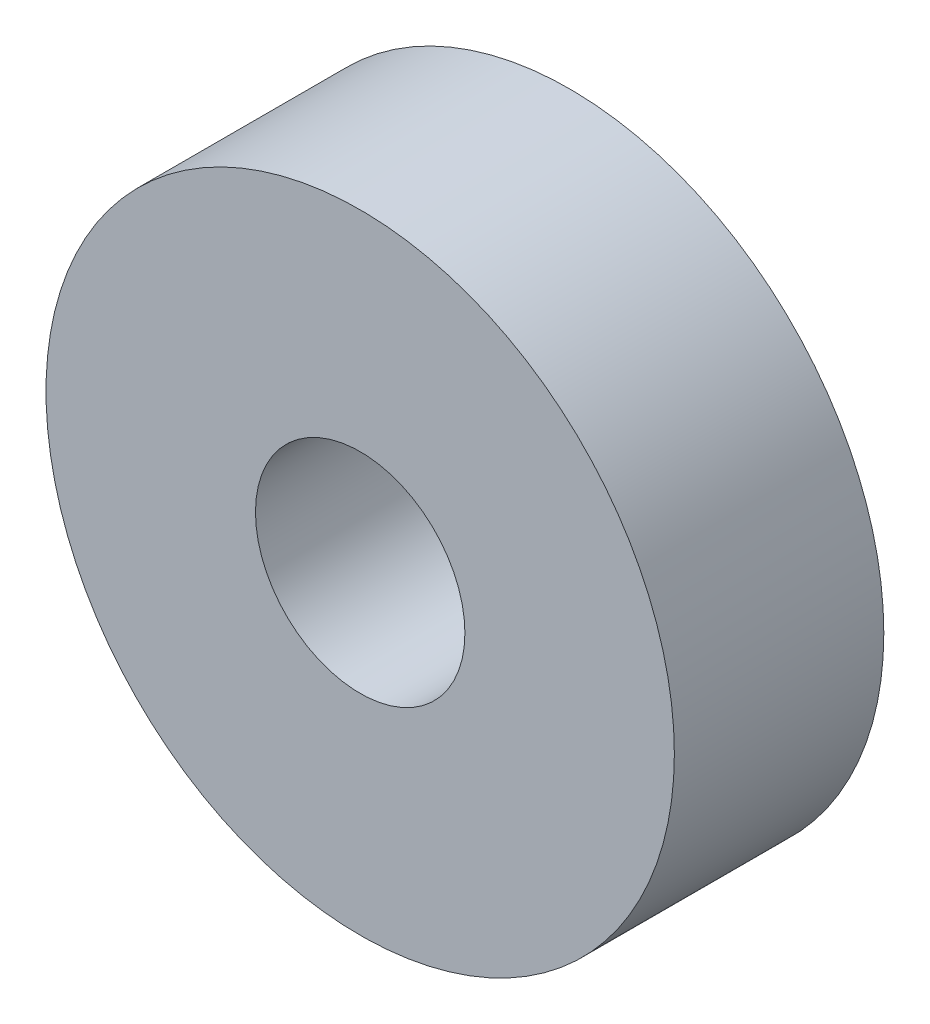
ISO-10303-21;
HEADER;
FILE_DESCRIPTION(('STEP AP214'),'2;1');
FILE_NAME('part.step','',(''),(''),'','','');
FILE_SCHEMA(('AUTOMOTIVE_DESIGN { 1 0 10303 214 1 1 1 1 }'));
ENDSEC;
DATA;
#1=APPLICATION_CONTEXT('core data for automotive mechanical design processes');
#2=APPLICATION_PROTOCOL_DEFINITION('international standard','automotive_design',2000,#1);
#3=PRODUCT_CONTEXT('',#1,'mechanical');
#4=PRODUCT('Part','Part','',(#3));
#5=PRODUCT_RELATED_PRODUCT_CATEGORY('part','',(#4));
#6=PRODUCT_DEFINITION_FORMATION('','',#4);
#7=PRODUCT_DEFINITION_CONTEXT('part definition',#1,'design');
#8=PRODUCT_DEFINITION('design','',#6,#7);
#9=PRODUCT_DEFINITION_SHAPE('','',#8);
#10=(LENGTH_UNIT() NAMED_UNIT(*) SI_UNIT(.MILLI.,.METRE.));
#11=(NAMED_UNIT(*) PLANE_ANGLE_UNIT() SI_UNIT($,.RADIAN.));
#12=(NAMED_UNIT(*) SI_UNIT($,.STERADIAN.) SOLID_ANGLE_UNIT());
#13=UNCERTAINTY_MEASURE_WITH_UNIT(LENGTH_MEASURE(1.E-05),#10,'distance_accuracy_value','');
#14=(GEOMETRIC_REPRESENTATION_CONTEXT(3) GLOBAL_UNCERTAINTY_ASSIGNED_CONTEXT((#13)) GLOBAL_UNIT_ASSIGNED_CONTEXT((#10,
#11,#12)) REPRESENTATION_CONTEXT('',''));
#15=CARTESIAN_POINT('',(0.,0.,0.));
#16=DIRECTION('',(0.,0.,1.));
#17=DIRECTION('',(1.,0.,0.));
#18=AXIS2_PLACEMENT_3D('',#15,#16,#17);
#19=CARTESIAN_POINT('',(115.4855939853,217.537062318,3.));
#20=DIRECTION('',(0.,0.,1.));
#21=DIRECTION('',(1.,0.,0.));
#22=AXIS2_PLACEMENT_3D('',#19,#20,#21);
#23=PLANE('',#22);
#24=CARTESIAN_POINT('',(115.4855939853,217.537062318,3.));
#25=DIRECTION('',(0.,0.,1.));
#26=DIRECTION('',(1.,0.,0.));
#27=AXIS2_PLACEMENT_3D('',#24,#25,#26);
#28=CIRCLE('',#27,4.5);
#29=CARTESIAN_POINT('',(119.9855939853,217.537062318,3.));
#30=VERTEX_POINT('',#29);
#31=EDGE_CURVE('E10',#30,#30,#28,.T.);
#32=ORIENTED_EDGE('',*,*,#31,.T.);
#33=EDGE_LOOP('',(#32));
#34=FACE_BOUND('',#33,.T.);
#35=CARTESIAN_POINT('',(115.4855939853,217.537062318,3.));
#36=DIRECTION('',(0.,0.,1.));
#37=DIRECTION('',(1.,0.,0.));
#38=AXIS2_PLACEMENT_3D('',#35,#36,#37);
#39=CIRCLE('',#38,1.5);
#40=CARTESIAN_POINT('',(116.9855939853,217.537062318,3.));
#41=VERTEX_POINT('',#40);
#42=EDGE_CURVE('E42',#41,#41,#39,.T.);
#43=ORIENTED_EDGE('',*,*,#42,.F.);
#44=EDGE_LOOP('',(#43));
#45=FACE_BOUND('',#44,.T.);
#46=ADVANCED_FACE('F31',(#34,#45),#23,.T.);
#47=CARTESIAN_POINT('',(115.4855939853,217.537062318,0.));
#48=DIRECTION('',(0.,0.,1.));
#49=DIRECTION('',(1.,0.,0.));
#50=AXIS2_PLACEMENT_3D('',#47,#48,#49);
#51=PLANE('',#50);
#52=CARTESIAN_POINT('',(115.4855939853,217.537062318,0.));
#53=DIRECTION('',(0.,0.,1.));
#54=DIRECTION('',(1.,0.,0.));
#55=AXIS2_PLACEMENT_3D('',#52,#53,#54);
#56=CIRCLE('',#55,4.5);
#57=CARTESIAN_POINT('',(119.9855939853,217.537062318,0.));
#58=VERTEX_POINT('',#57);
#59=EDGE_CURVE('E35',#58,#58,#56,.T.);
#60=ORIENTED_EDGE('',*,*,#59,.F.);
#61=EDGE_LOOP('',(#60));
#62=FACE_BOUND('',#61,.T.);
#63=CARTESIAN_POINT('',(115.4855939853,217.537062318,0.));
#64=DIRECTION('',(0.,0.,1.));
#65=DIRECTION('',(1.,0.,0.));
#66=AXIS2_PLACEMENT_3D('',#63,#64,#65);
#67=CIRCLE('',#66,1.5);
#68=CARTESIAN_POINT('',(116.9855939853,217.537062318,0.));
#69=VERTEX_POINT('',#68);
#70=EDGE_CURVE('E44',#69,#69,#67,.T.);
#71=ORIENTED_EDGE('',*,*,#70,.T.);
#72=EDGE_LOOP('',(#71));
#73=FACE_BOUND('',#72,.T.);
#74=ADVANCED_FACE('F54',(#62,#73),#51,.F.);
#75=CARTESIAN_POINT('',(115.4855939853,217.537062318,3.));
#76=DIRECTION('',(0.,0.,-1.));
#77=DIRECTION('',(-1.,0.,0.));
#78=AXIS2_PLACEMENT_3D('',#75,#76,#77);
#79=CYLINDRICAL_SURFACE('',#78,4.5);
#80=ORIENTED_EDGE('',*,*,#31,.F.);
#81=EDGE_LOOP('',(#80));
#82=FACE_BOUND('',#81,.T.);
#83=ORIENTED_EDGE('',*,*,#59,.T.);
#84=EDGE_LOOP('',(#83));
#85=FACE_BOUND('',#84,.T.);
#86=ADVANCED_FACE('F33',(#82,#85),#79,.T.);
#87=CARTESIAN_POINT('',(115.4855939853,217.537062318,3.));
#88=DIRECTION('',(0.,0.,-1.));
#89=DIRECTION('',(-1.,0.,0.));
#90=AXIS2_PLACEMENT_3D('',#87,#88,#89);
#91=CYLINDRICAL_SURFACE('',#90,1.5);
#92=ORIENTED_EDGE('',*,*,#42,.T.);
#93=EDGE_LOOP('',(#92));
#94=FACE_BOUND('',#93,.T.);
#95=ORIENTED_EDGE('',*,*,#70,.F.);
#96=EDGE_LOOP('',(#95));
#97=FACE_BOUND('',#96,.T.);
#98=ADVANCED_FACE('F50',(#94,#97),#91,.F.);
#99=CLOSED_SHELL('',(#46,#74,#86,#98));
#100=MANIFOLD_SOLID_BREP('B2',#99);
#101=ADVANCED_BREP_SHAPE_REPRESENTATION('',(#18,#100),#14);
#102=SHAPE_DEFINITION_REPRESENTATION(#9,#101);
ENDSEC;
END-ISO-10303-21;
